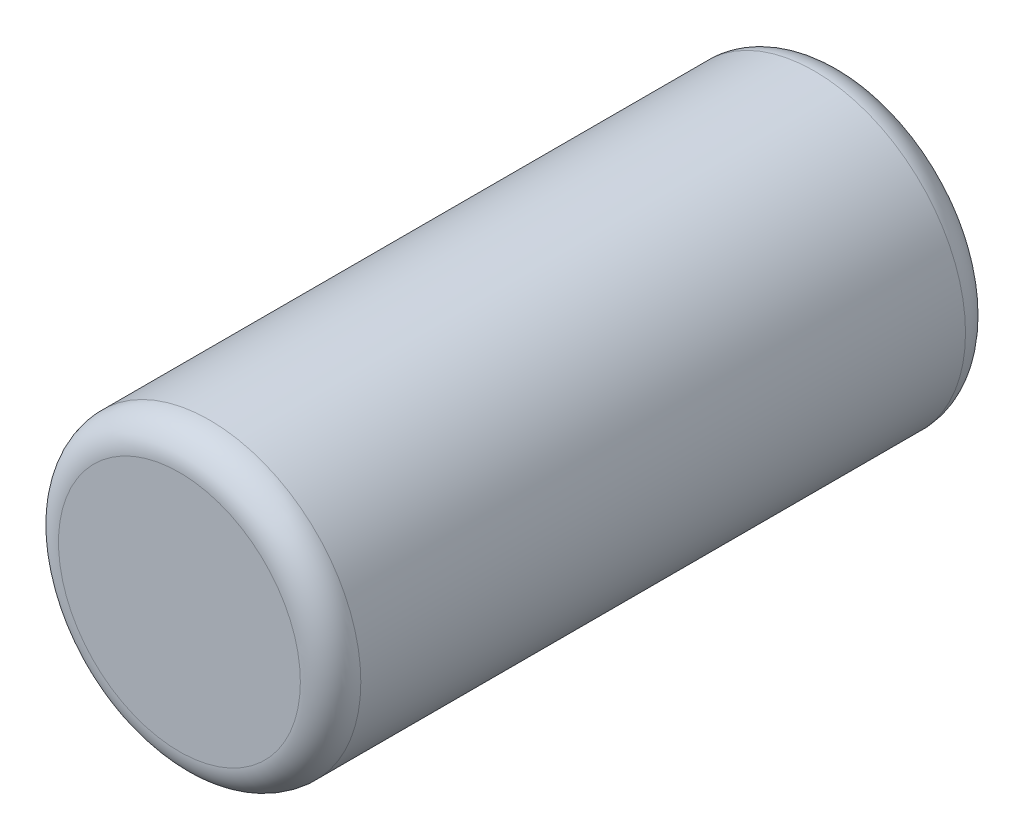
ISO-10303-21;
HEADER;
FILE_DESCRIPTION(('STEP AP214'),'2;1');
FILE_NAME('part.step','',(''),(''),'','','');
FILE_SCHEMA(('AUTOMOTIVE_DESIGN { 1 0 10303 214 1 1 1 1 }'));
ENDSEC;
DATA;
#1=APPLICATION_CONTEXT('core data for automotive mechanical design processes');
#2=APPLICATION_PROTOCOL_DEFINITION('international standard','automotive_design',2000,#1);
#3=PRODUCT_CONTEXT('',#1,'mechanical');
#4=PRODUCT('Part','Part','',(#3));
#5=PRODUCT_RELATED_PRODUCT_CATEGORY('part','',(#4));
#6=PRODUCT_DEFINITION_FORMATION('','',#4);
#7=PRODUCT_DEFINITION_CONTEXT('part definition',#1,'design');
#8=PRODUCT_DEFINITION('design','',#6,#7);
#9=PRODUCT_DEFINITION_SHAPE('','',#8);
#10=(LENGTH_UNIT() NAMED_UNIT(*) SI_UNIT(.MILLI.,.METRE.));
#11=(NAMED_UNIT(*) PLANE_ANGLE_UNIT() SI_UNIT($,.RADIAN.));
#12=(NAMED_UNIT(*) SI_UNIT($,.STERADIAN.) SOLID_ANGLE_UNIT());
#13=UNCERTAINTY_MEASURE_WITH_UNIT(LENGTH_MEASURE(1.E-05),#10,'distance_accuracy_value','');
#14=(GEOMETRIC_REPRESENTATION_CONTEXT(3) GLOBAL_UNCERTAINTY_ASSIGNED_CONTEXT((#13)) GLOBAL_UNIT_ASSIGNED_CONTEXT((#10,
#11,#12)) REPRESENTATION_CONTEXT('',''));
#15=CARTESIAN_POINT('',(0.,0.,0.));
#16=DIRECTION('',(0.,0.,1.));
#17=DIRECTION('',(1.,0.,0.));
#18=AXIS2_PLACEMENT_3D('',#15,#16,#17);
#19=CARTESIAN_POINT('',(0.,0.,22.));
#20=DIRECTION('',(0.,0.,-1.));
#21=DIRECTION('',(-1.,0.,0.));
#22=AXIS2_PLACEMENT_3D('',#19,#20,#21);
#23=CYLINDRICAL_SURFACE('',#22,5.);
#24=CARTESIAN_POINT('',(0.,0.,21.));
#25=DIRECTION('',(0.,0.,1.));
#26=DIRECTION('',(1.,0.,0.));
#27=AXIS2_PLACEMENT_3D('',#24,#25,#26);
#28=CIRCLE('',#27,5.);
#29=CARTESIAN_POINT('',(5.,0.,21.));
#30=VERTEX_POINT('',#29);
#31=EDGE_CURVE('E51',#30,#30,#28,.F.);
#32=ORIENTED_EDGE('',*,*,#31,.T.);
#33=EDGE_LOOP('',(#32));
#34=FACE_BOUND('',#33,.T.);
#35=CARTESIAN_POINT('',(0.,0.,1.));
#36=DIRECTION('',(0.,0.,1.));
#37=DIRECTION('',(1.,0.,0.));
#38=AXIS2_PLACEMENT_3D('',#35,#36,#37);
#39=CIRCLE('',#38,5.);
#40=CARTESIAN_POINT('',(5.,0.,1.));
#41=VERTEX_POINT('',#40);
#42=EDGE_CURVE('E56',#41,#41,#39,.T.);
#43=ORIENTED_EDGE('',*,*,#42,.T.);
#44=EDGE_LOOP('',(#43));
#45=FACE_BOUND('',#44,.T.);
#46=ADVANCED_FACE('F43',(#34,#45),#23,.T.);
#47=CARTESIAN_POINT('',(0.,0.,22.));
#48=DIRECTION('',(0.,0.,1.));
#49=DIRECTION('',(1.,0.,0.));
#50=AXIS2_PLACEMENT_3D('',#47,#48,#49);
#51=PLANE('',#50);
#52=CARTESIAN_POINT('',(0.,0.,22.));
#53=DIRECTION('',(0.,0.,1.));
#54=DIRECTION('',(1.,0.,0.));
#55=AXIS2_PLACEMENT_3D('',#52,#53,#54);
#56=CIRCLE('',#55,4.);
#57=CARTESIAN_POINT('',(4.,0.,22.));
#58=VERTEX_POINT('',#57);
#59=EDGE_CURVE('E61',#58,#58,#56,.T.);
#60=ORIENTED_EDGE('',*,*,#59,.T.);
#61=EDGE_LOOP('',(#60));
#62=FACE_BOUND('',#61,.T.);
#63=ADVANCED_FACE('F68',(#62),#51,.T.);
#64=CARTESIAN_POINT('',(0.,0.,0.));
#65=DIRECTION('',(0.,0.,1.));
#66=DIRECTION('',(1.,0.,0.));
#67=AXIS2_PLACEMENT_3D('',#64,#65,#66);
#68=PLANE('',#67);
#69=CARTESIAN_POINT('',(0.,0.,0.));
#70=DIRECTION('',(0.,0.,1.));
#71=DIRECTION('',(1.,0.,0.));
#72=AXIS2_PLACEMENT_3D('',#69,#70,#71);
#73=CIRCLE('',#72,4.);
#74=CARTESIAN_POINT('',(4.,0.,0.));
#75=VERTEX_POINT('',#74);
#76=EDGE_CURVE('E10',#75,#75,#73,.F.);
#77=ORIENTED_EDGE('',*,*,#76,.T.);
#78=EDGE_LOOP('',(#77));
#79=FACE_BOUND('',#78,.T.);
#80=ADVANCED_FACE('F72',(#79),#68,.F.);
#81=CARTESIAN_POINT('',(0.,0.,21.));
#82=DIRECTION('',(0.,0.,1.));
#83=DIRECTION('',(1.,0.,0.));
#84=AXIS2_PLACEMENT_3D('',#81,#82,#83);
#85=TOROIDAL_SURFACE('',#84,4.,1.);
#86=ORIENTED_EDGE('',*,*,#31,.F.);
#87=EDGE_LOOP('',(#86));
#88=FACE_BOUND('',#87,.T.);
#89=ORIENTED_EDGE('',*,*,#59,.F.);
#90=EDGE_LOOP('',(#89));
#91=FACE_BOUND('',#90,.T.);
#92=ADVANCED_FACE('F70',(#88,#91),#85,.T.);
#93=CARTESIAN_POINT('',(0.,0.,1.));
#94=DIRECTION('',(0.,0.,1.));
#95=DIRECTION('',(1.,0.,0.));
#96=AXIS2_PLACEMENT_3D('',#93,#94,#95);
#97=TOROIDAL_SURFACE('',#96,4.,1.);
#98=ORIENTED_EDGE('',*,*,#76,.F.);
#99=EDGE_LOOP('',(#98));
#100=FACE_BOUND('',#99,.T.);
#101=ORIENTED_EDGE('',*,*,#42,.F.);
#102=EDGE_LOOP('',(#101));
#103=FACE_BOUND('',#102,.T.);
#104=ADVANCED_FACE('F45',(#100,#103),#97,.T.);
#105=CLOSED_SHELL('',(#46,#63,#80,#92,#104));
#106=MANIFOLD_SOLID_BREP('B2',#105);
#107=ADVANCED_BREP_SHAPE_REPRESENTATION('',(#18,#106),#14);
#108=SHAPE_DEFINITION_REPRESENTATION(#9,#107);
ENDSEC;
END-ISO-10303-21;
